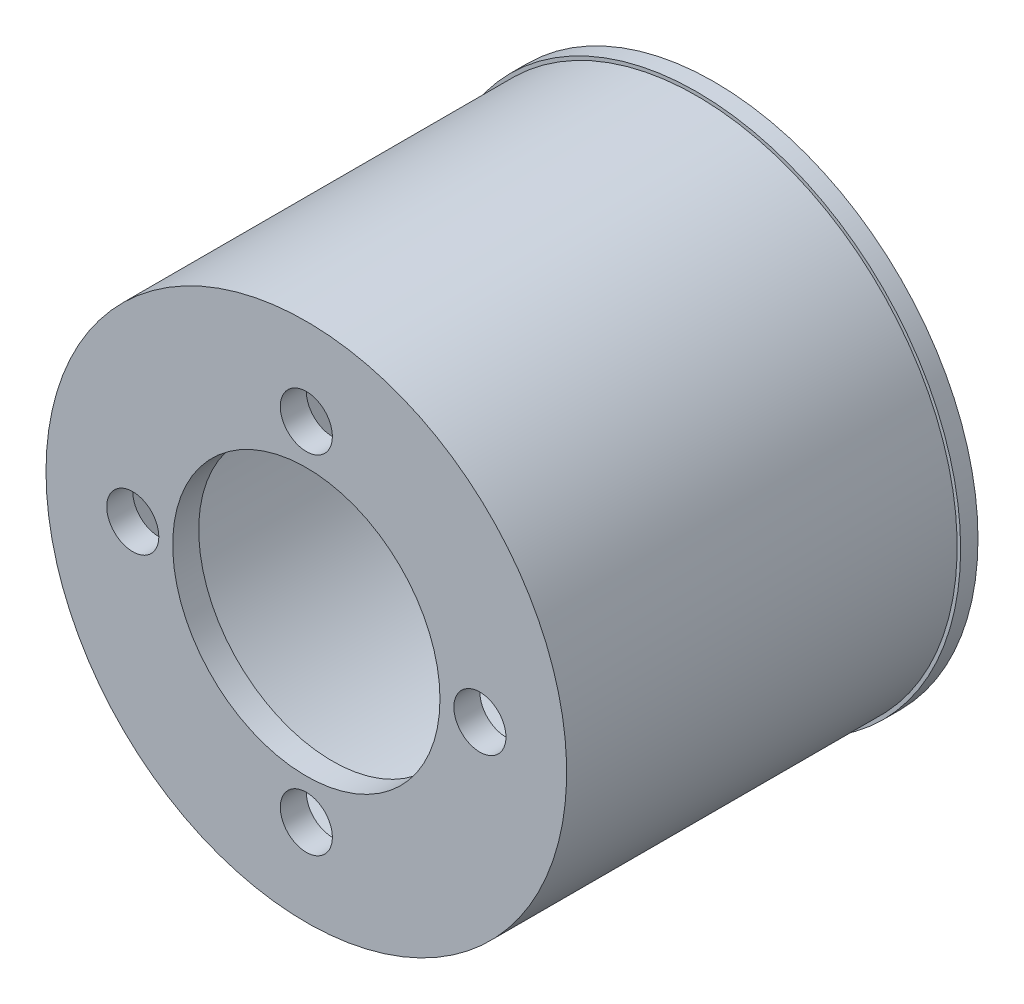
ISO-10303-21;
HEADER;
FILE_DESCRIPTION(('STEP AP214'),'2;1');
FILE_NAME('part.step','',(''),(''),'','','');
FILE_SCHEMA(('AUTOMOTIVE_DESIGN { 1 0 10303 214 1 1 1 1 }'));
ENDSEC;
DATA;
#1=APPLICATION_CONTEXT('core data for automotive mechanical design processes');
#2=APPLICATION_PROTOCOL_DEFINITION('international standard','automotive_design',2000,#1);
#3=PRODUCT_CONTEXT('',#1,'mechanical');
#4=PRODUCT('Part','Part','',(#3));
#5=PRODUCT_RELATED_PRODUCT_CATEGORY('part','',(#4));
#6=PRODUCT_DEFINITION_FORMATION('','',#4);
#7=PRODUCT_DEFINITION_CONTEXT('part definition',#1,'design');
#8=PRODUCT_DEFINITION('design','',#6,#7);
#9=PRODUCT_DEFINITION_SHAPE('','',#8);
#10=(LENGTH_UNIT() NAMED_UNIT(*) SI_UNIT(.MILLI.,.METRE.));
#11=(NAMED_UNIT(*) PLANE_ANGLE_UNIT() SI_UNIT($,.RADIAN.));
#12=(NAMED_UNIT(*) SI_UNIT($,.STERADIAN.) SOLID_ANGLE_UNIT());
#13=UNCERTAINTY_MEASURE_WITH_UNIT(LENGTH_MEASURE(1.E-05),#10,'distance_accuracy_value','');
#14=(GEOMETRIC_REPRESENTATION_CONTEXT(3) GLOBAL_UNCERTAINTY_ASSIGNED_CONTEXT((#13)) GLOBAL_UNIT_ASSIGNED_CONTEXT((#10,
#11,#12)) REPRESENTATION_CONTEXT('',''));
#15=CARTESIAN_POINT('',(0.,0.,0.));
#16=DIRECTION('',(0.,0.,1.));
#17=DIRECTION('',(1.,0.,0.));
#18=AXIS2_PLACEMENT_3D('',#15,#16,#17);
#19=CARTESIAN_POINT('',(0.,0.,21.));
#20=DIRECTION('',(0.,0.,-1.));
#21=DIRECTION('',(-1.,0.,0.));
#22=AXIS2_PLACEMENT_3D('',#19,#20,#21);
#23=CYLINDRICAL_SURFACE('',#22,15.);
#24=CARTESIAN_POINT('',(0.,0.,0.));
#25=DIRECTION('',(0.,0.,-1.));
#26=DIRECTION('',(-1.,0.,0.));
#27=AXIS2_PLACEMENT_3D('',#24,#25,#26);
#28=CIRCLE('',#27,15.);
#29=CARTESIAN_POINT('',(-15.,0.,0.));
#30=VERTEX_POINT('',#29);
#31=EDGE_CURVE('E10',#30,#30,#28,.T.);
#32=CARTESIAN_POINT('',(0.,0.,22.5));
#33=DIRECTION('',(0.,0.,1.));
#34=DIRECTION('',(1.,0.,0.));
#35=AXIS2_PLACEMENT_3D('',#32,#33,#34);
#36=CIRCLE('',#35,15.);
#37=CARTESIAN_POINT('',(-15.,0.,22.5));
#38=VERTEX_POINT('',#37);
#39=EDGE_CURVE('E55',#38,#38,#36,.T.);
#40=CARTESIAN_POINT('',(-15.,0.,0.));
#41=CARTESIAN_POINT('',(-15.,0.,0.234375));
#42=CARTESIAN_POINT('',(-15.,0.,0.468749999999999));
#43=CARTESIAN_POINT('',(-15.,0.,0.9375));
#44=CARTESIAN_POINT('',(-15.,0.,1.171875));
#45=CARTESIAN_POINT('',(-15.,0.,1.640625));
#46=CARTESIAN_POINT('',(-15.,0.,1.875));
#47=CARTESIAN_POINT('',(-15.,0.,2.34375));
#48=CARTESIAN_POINT('',(-15.,0.,2.578125));
#49=CARTESIAN_POINT('',(-15.,0.,3.046875));
#50=CARTESIAN_POINT('',(-15.,0.,3.28125));
#51=CARTESIAN_POINT('',(-15.,0.,3.75));
#52=CARTESIAN_POINT('',(-15.,0.,3.984375));
#53=CARTESIAN_POINT('',(-15.,0.,4.453125));
#54=CARTESIAN_POINT('',(-15.,0.,4.6875));
#55=CARTESIAN_POINT('',(-15.,0.,5.15625));
#56=CARTESIAN_POINT('',(-15.,0.,5.390625));
#57=CARTESIAN_POINT('',(-15.,0.,5.859375));
#58=CARTESIAN_POINT('',(-15.,0.,6.09375));
#59=CARTESIAN_POINT('',(-15.,0.,6.5625));
#60=CARTESIAN_POINT('',(-15.,0.,6.796875));
#61=CARTESIAN_POINT('',(-15.,0.,7.265625));
#62=CARTESIAN_POINT('',(-15.,0.,7.5));
#63=CARTESIAN_POINT('',(-15.,0.,7.96875));
#64=CARTESIAN_POINT('',(-15.,0.,8.203125));
#65=CARTESIAN_POINT('',(-15.,0.,8.671875));
#66=CARTESIAN_POINT('',(-15.,0.,8.90625));
#67=CARTESIAN_POINT('',(-15.,0.,9.375));
#68=CARTESIAN_POINT('',(-15.,0.,9.609375));
#69=CARTESIAN_POINT('',(-15.,0.,10.078125));
#70=CARTESIAN_POINT('',(-15.,0.,10.3125));
#71=CARTESIAN_POINT('',(-15.,0.,10.78125));
#72=CARTESIAN_POINT('',(-15.,0.,11.015625));
#73=CARTESIAN_POINT('',(-15.,0.,11.484375));
#74=CARTESIAN_POINT('',(-15.,0.,11.71875));
#75=CARTESIAN_POINT('',(-15.,0.,12.1875));
#76=CARTESIAN_POINT('',(-15.,0.,12.421875));
#77=CARTESIAN_POINT('',(-15.,0.,12.890625));
#78=CARTESIAN_POINT('',(-15.,0.,13.125));
#79=CARTESIAN_POINT('',(-15.,0.,13.59375));
#80=CARTESIAN_POINT('',(-15.,0.,13.828125));
#81=CARTESIAN_POINT('',(-15.,0.,14.296875));
#82=CARTESIAN_POINT('',(-15.,0.,14.53125));
#83=CARTESIAN_POINT('',(-15.,0.,15.));
#84=CARTESIAN_POINT('',(-15.,0.,15.234375));
#85=CARTESIAN_POINT('',(-15.,0.,15.703125));
#86=CARTESIAN_POINT('',(-15.,0.,15.9375));
#87=CARTESIAN_POINT('',(-15.,0.,16.40625));
#88=CARTESIAN_POINT('',(-15.,0.,16.640625));
#89=CARTESIAN_POINT('',(-15.,0.,17.109375));
#90=CARTESIAN_POINT('',(-15.,0.,17.34375));
#91=CARTESIAN_POINT('',(-15.,0.,17.8125));
#92=CARTESIAN_POINT('',(-15.,0.,18.046875));
#93=CARTESIAN_POINT('',(-15.,0.,18.515625));
#94=CARTESIAN_POINT('',(-15.,0.,18.75));
#95=CARTESIAN_POINT('',(-15.,0.,19.21875));
#96=CARTESIAN_POINT('',(-15.,0.,19.453125));
#97=CARTESIAN_POINT('',(-15.,0.,19.921875));
#98=CARTESIAN_POINT('',(-15.,0.,20.15625));
#99=CARTESIAN_POINT('',(-15.,0.,20.625));
#100=CARTESIAN_POINT('',(-15.,0.,20.859375));
#101=CARTESIAN_POINT('',(-15.,0.,21.328125));
#102=CARTESIAN_POINT('',(-15.,0.,21.5625));
#103=CARTESIAN_POINT('',(-15.,0.,22.03125));
#104=CARTESIAN_POINT('',(-15.,0.,22.265625));
#105=CARTESIAN_POINT('',(-15.,0.,22.5));
#106=B_SPLINE_CURVE_WITH_KNOTS('',3,(#40,#41,#42,#43,#44,#45,#46,#47,#48,#49,#50,#51,#52,#53,
#54,#55,#56,#57,#58,#59,#60,#61,#62,#63,#64,#65,#66,#67,#68,#69,#70,#71,#72,#73,#74,#75,#76,#77,
#78,#79,#80,#81,#82,#83,#84,#85,#86,#87,#88,#89,#90,#91,#92,#93,#94,#95,#96,#97,#98,#99,#100,
#101,#102,#103,#104,#105),.UNSPECIFIED.,.F.,.F.,(4,2,2,2,2,2,2,2,2,2,2,2,2,2,2,2,2,2,2,2,2,2,2,
2,2,2,2,2,2,2,2,2,4),(0.,0.703124999999999,1.40625,2.109375,2.8125,3.515625,4.21875,4.921875,
5.625,6.328125,7.03125,7.734375,8.4375,9.140625,9.84375,10.546875,11.25,11.953125,12.65625,
13.359375,14.0625,14.765625,15.46875,16.171875,16.875,17.578125,18.28125,18.984375,19.6875,
20.390625,21.09375,21.796875,22.5),.UNSPECIFIED.);
#107=EDGE_CURVE('BSEAM33',#30,#38,#106,.T.);
#108=ORIENTED_EDGE('',*,*,#31,.F.);
#109=ORIENTED_EDGE('',*,*,#39,.F.);
#110=ORIENTED_EDGE('',*,*,#107,.T.);
#111=ORIENTED_EDGE('',*,*,#107,.F.);
#112=EDGE_LOOP('',(#108,#110,#109,#111));
#113=FACE_BOUND('',#112,.T.);
#114=ADVANCED_FACE('F33',(#113),#23,.T.);
#115=CARTESIAN_POINT('',(0.,0.,21.));
#116=DIRECTION('',(0.,0.,-1.));
#117=DIRECTION('',(-1.,0.,0.));
#118=AXIS2_PLACEMENT_3D('',#115,#116,#117);
#119=CYLINDRICAL_SURFACE('',#118,13.35);
#120=CARTESIAN_POINT('',(0.,0.,21.));
#121=DIRECTION('',(0.,0.,1.));
#122=DIRECTION('',(1.,0.,0.));
#123=AXIS2_PLACEMENT_3D('',#120,#121,#122);
#124=CIRCLE('',#123,13.35);
#125=CARTESIAN_POINT('',(-13.35,0.,21.));
#126=VERTEX_POINT('',#125);
#127=EDGE_CURVE('E52',#126,#126,#124,.T.);
#128=CARTESIAN_POINT('',(0.,0.,-1.));
#129=DIRECTION('',(0.,0.,-1.));
#130=DIRECTION('',(-1.,0.,0.));
#131=AXIS2_PLACEMENT_3D('',#128,#129,#130);
#132=CIRCLE('',#131,13.35);
#133=CARTESIAN_POINT('',(-13.35,0.,-1.));
#134=VERTEX_POINT('',#133);
#135=EDGE_CURVE('E48',#134,#134,#132,.T.);
#136=CARTESIAN_POINT('',(-13.35,0.,21.));
#137=CARTESIAN_POINT('',(-13.35,0.,20.7708333333333));
#138=CARTESIAN_POINT('',(-13.35,0.,20.5416666666667));
#139=CARTESIAN_POINT('',(-13.35,0.,20.0833333333333));
#140=CARTESIAN_POINT('',(-13.35,0.,19.8541666666667));
#141=CARTESIAN_POINT('',(-13.35,0.,19.3958333333333));
#142=CARTESIAN_POINT('',(-13.35,0.,19.1666666666667));
#143=CARTESIAN_POINT('',(-13.35,0.,18.7083333333333));
#144=CARTESIAN_POINT('',(-13.35,0.,18.4791666666667));
#145=CARTESIAN_POINT('',(-13.35,0.,18.0208333333333));
#146=CARTESIAN_POINT('',(-13.35,0.,17.7916666666667));
#147=CARTESIAN_POINT('',(-13.35,0.,17.3333333333333));
#148=CARTESIAN_POINT('',(-13.35,0.,17.1041666666667));
#149=CARTESIAN_POINT('',(-13.35,0.,16.6458333333333));
#150=CARTESIAN_POINT('',(-13.35,0.,16.4166666666667));
#151=CARTESIAN_POINT('',(-13.35,0.,15.9583333333333));
#152=CARTESIAN_POINT('',(-13.35,0.,15.7291666666667));
#153=CARTESIAN_POINT('',(-13.35,0.,15.2708333333333));
#154=CARTESIAN_POINT('',(-13.35,0.,15.0416666666667));
#155=CARTESIAN_POINT('',(-13.35,0.,14.5833333333333));
#156=CARTESIAN_POINT('',(-13.35,0.,14.3541666666667));
#157=CARTESIAN_POINT('',(-13.35,0.,13.8958333333333));
#158=CARTESIAN_POINT('',(-13.35,0.,13.6666666666667));
#159=CARTESIAN_POINT('',(-13.35,0.,13.2083333333333));
#160=CARTESIAN_POINT('',(-13.35,0.,12.9791666666667));
#161=CARTESIAN_POINT('',(-13.35,0.,12.5208333333333));
#162=CARTESIAN_POINT('',(-13.35,0.,12.2916666666667));
#163=CARTESIAN_POINT('',(-13.35,0.,11.8333333333333));
#164=CARTESIAN_POINT('',(-13.35,0.,11.6041666666667));
#165=CARTESIAN_POINT('',(-13.35,0.,11.1458333333333));
#166=CARTESIAN_POINT('',(-13.35,0.,10.9166666666667));
#167=CARTESIAN_POINT('',(-13.35,0.,10.4583333333333));
#168=CARTESIAN_POINT('',(-13.35,0.,10.2291666666667));
#169=CARTESIAN_POINT('',(-13.35,0.,9.77083333333333));
#170=CARTESIAN_POINT('',(-13.35,0.,9.54166666666667));
#171=CARTESIAN_POINT('',(-13.35,0.,9.08333333333333));
#172=CARTESIAN_POINT('',(-13.35,0.,8.85416666666667));
#173=CARTESIAN_POINT('',(-13.35,0.,8.39583333333333));
#174=CARTESIAN_POINT('',(-13.35,0.,8.16666666666667));
#175=CARTESIAN_POINT('',(-13.35,0.,7.70833333333333));
#176=CARTESIAN_POINT('',(-13.35,0.,7.47916666666667));
#177=CARTESIAN_POINT('',(-13.35,0.,7.02083333333333));
#178=CARTESIAN_POINT('',(-13.35,0.,6.79166666666667));
#179=CARTESIAN_POINT('',(-13.35,0.,6.33333333333333));
#180=CARTESIAN_POINT('',(-13.35,0.,6.10416666666667));
#181=CARTESIAN_POINT('',(-13.35,0.,5.64583333333333));
#182=CARTESIAN_POINT('',(-13.35,0.,5.41666666666667));
#183=CARTESIAN_POINT('',(-13.35,0.,4.95833333333333));
#184=CARTESIAN_POINT('',(-13.35,0.,4.72916666666667));
#185=CARTESIAN_POINT('',(-13.35,0.,4.27083333333333));
#186=CARTESIAN_POINT('',(-13.35,0.,4.04166666666667));
#187=CARTESIAN_POINT('',(-13.35,0.,3.58333333333333));
#188=CARTESIAN_POINT('',(-13.35,0.,3.35416666666667));
#189=CARTESIAN_POINT('',(-13.35,0.,2.89583333333333));
#190=CARTESIAN_POINT('',(-13.35,0.,2.66666666666667));
#191=CARTESIAN_POINT('',(-13.35,0.,2.20833333333333));
#192=CARTESIAN_POINT('',(-13.35,0.,1.97916666666667));
#193=CARTESIAN_POINT('',(-13.35,0.,1.52083333333333));
#194=CARTESIAN_POINT('',(-13.35,0.,1.29166666666667));
#195=CARTESIAN_POINT('',(-13.35,0.,0.833333333333334));
#196=CARTESIAN_POINT('',(-13.35,0.,0.604166666666667));
#197=CARTESIAN_POINT('',(-13.35,0.,0.145833333333334));
#198=CARTESIAN_POINT('',(-13.35,0.,-0.0833333333333333));
#199=CARTESIAN_POINT('',(-13.35,0.,-0.541666666666667));
#200=CARTESIAN_POINT('',(-13.35,0.,-0.770833333333334));
#201=CARTESIAN_POINT('',(-13.35,0.,-1.));
#202=B_SPLINE_CURVE_WITH_KNOTS('',3,(#136,#137,#138,#139,#140,#141,#142,#143,#144,#145,#146,
#147,#148,#149,#150,#151,#152,#153,#154,#155,#156,#157,#158,#159,#160,#161,#162,#163,#164,#165,
#166,#167,#168,#169,#170,#171,#172,#173,#174,#175,#176,#177,#178,#179,#180,#181,#182,#183,#184,
#185,#186,#187,#188,#189,#190,#191,#192,#193,#194,#195,#196,#197,#198,#199,#200,#201),
.UNSPECIFIED.,.F.,.F.,(4,2,2,2,2,2,2,2,2,2,2,2,2,2,2,2,2,2,2,2,2,2,2,2,2,2,2,2,2,2,2,2,4),(0.,
0.687499999999997,1.375,2.0625,2.75,3.4375,4.125,4.8125,5.5,6.1875,6.875,7.5625,8.25,8.9375,
9.625,10.3125,11.,11.6875,12.375,13.0625,13.75,14.4375,15.125,15.8125,16.5,17.1875,17.875,
18.5625,19.25,19.9375,20.625,21.3125,22.),.UNSPECIFIED.);
#203=EDGE_CURVE('BSEAM111',#126,#134,#202,.T.);
#204=ORIENTED_EDGE('',*,*,#127,.T.);
#205=ORIENTED_EDGE('',*,*,#135,.T.);
#206=ORIENTED_EDGE('',*,*,#203,.T.);
#207=ORIENTED_EDGE('',*,*,#203,.F.);
#208=EDGE_LOOP('',(#204,#206,#205,#207));
#209=FACE_BOUND('',#208,.T.);
#210=ADVANCED_FACE('F111',(#209),#119,.F.);
#211=CARTESIAN_POINT('',(0.,0.,0.));
#212=DIRECTION('',(0.,0.,-1.));
#213=DIRECTION('',(-1.,0.,0.));
#214=AXIS2_PLACEMENT_3D('',#211,#212,#213);
#215=PLANE('',#214);
#216=CARTESIAN_POINT('',(0.,0.,0.));
#217=DIRECTION('',(0.,0.,-1.));
#218=DIRECTION('',(-1.,0.,0.));
#219=AXIS2_PLACEMENT_3D('',#216,#217,#218);
#220=CIRCLE('',#219,15.2);
#221=CARTESIAN_POINT('',(-15.2,0.,0.));
#222=VERTEX_POINT('',#221);
#223=EDGE_CURVE('E43',#222,#222,#220,.T.);
#224=ORIENTED_EDGE('',*,*,#223,.F.);
#225=EDGE_LOOP('',(#224));
#226=FACE_BOUND('',#225,.T.);
#227=ORIENTED_EDGE('',*,*,#31,.T.);
#228=EDGE_LOOP('',(#227));
#229=FACE_BOUND('',#228,.T.);
#230=ADVANCED_FACE('F116',(#226,#229),#215,.F.);
#231=CARTESIAN_POINT('',(0.,0.,-1.));
#232=DIRECTION('',(0.,0.,-1.));
#233=DIRECTION('',(-1.,0.,0.));
#234=AXIS2_PLACEMENT_3D('',#231,#232,#233);
#235=PLANE('',#234);
#236=CARTESIAN_POINT('',(0.,0.,-1.));
#237=DIRECTION('',(0.,0.,-1.));
#238=DIRECTION('',(-1.,0.,0.));
#239=AXIS2_PLACEMENT_3D('',#236,#237,#238);
#240=CIRCLE('',#239,15.2);
#241=CARTESIAN_POINT('',(-15.2,0.,-1.));
#242=VERTEX_POINT('',#241);
#243=EDGE_CURVE('E39',#242,#242,#240,.T.);
#244=ORIENTED_EDGE('',*,*,#243,.T.);
#245=EDGE_LOOP('',(#244));
#246=FACE_BOUND('',#245,.T.);
#247=ORIENTED_EDGE('',*,*,#135,.F.);
#248=EDGE_LOOP('',(#247));
#249=FACE_BOUND('',#248,.T.);
#250=ADVANCED_FACE('F142',(#246,#249),#235,.T.);
#251=CARTESIAN_POINT('',(0.,0.,-1.));
#252=DIRECTION('',(0.,0.,1.));
#253=DIRECTION('',(1.,0.,0.));
#254=AXIS2_PLACEMENT_3D('',#251,#252,#253);
#255=CYLINDRICAL_SURFACE('',#254,15.2);
#256=ORIENTED_EDGE('',*,*,#243,.F.);
#257=EDGE_LOOP('',(#256));
#258=FACE_BOUND('',#257,.T.);
#259=ORIENTED_EDGE('',*,*,#223,.T.);
#260=EDGE_LOOP('',(#259));
#261=FACE_BOUND('',#260,.T.);
#262=ADVANCED_FACE('F105',(#258,#261),#255,.T.);
#263=CARTESIAN_POINT('',(0.,0.,21.));
#264=DIRECTION('',(0.,0.,1.));
#265=DIRECTION('',(1.,0.,0.));
#266=AXIS2_PLACEMENT_3D('',#263,#264,#265);
#267=PLANE('',#266);
#268=CARTESIAN_POINT('',(10.,0.,21.));
#269=DIRECTION('',(0.,0.,1.));
#270=DIRECTION('',(1.,0.,0.));
#271=AXIS2_PLACEMENT_3D('',#268,#269,#270);
#272=CIRCLE('',#271,1.5);
#273=CARTESIAN_POINT('',(11.5,0.,21.));
#274=VERTEX_POINT('',#273);
#275=EDGE_CURVE('E83',#274,#274,#272,.T.);
#276=ORIENTED_EDGE('',*,*,#275,.T.);
#277=EDGE_LOOP('',(#276));
#278=FACE_BOUND('',#277,.T.);
#279=CARTESIAN_POINT('',(-10.,0.,21.));
#280=DIRECTION('',(0.,0.,1.));
#281=DIRECTION('',(1.,0.,0.));
#282=AXIS2_PLACEMENT_3D('',#279,#280,#281);
#283=CIRCLE('',#282,1.5);
#284=CARTESIAN_POINT('',(-8.5,0.,21.));
#285=VERTEX_POINT('',#284);
#286=EDGE_CURVE('E77',#285,#285,#283,.T.);
#287=ORIENTED_EDGE('',*,*,#286,.T.);
#288=EDGE_LOOP('',(#287));
#289=FACE_BOUND('',#288,.T.);
#290=CARTESIAN_POINT('',(0.,10.,21.));
#291=DIRECTION('',(0.,0.,1.));
#292=DIRECTION('',(1.,0.,0.));
#293=AXIS2_PLACEMENT_3D('',#290,#291,#292);
#294=CIRCLE('',#293,1.5);
#295=CARTESIAN_POINT('',(1.49999999999999,10.,21.));
#296=VERTEX_POINT('',#295);
#297=EDGE_CURVE('E71',#296,#296,#294,.T.);
#298=ORIENTED_EDGE('',*,*,#297,.T.);
#299=EDGE_LOOP('',(#298));
#300=FACE_BOUND('',#299,.T.);
#301=CARTESIAN_POINT('',(0.,-10.,21.));
#302=DIRECTION('',(0.,0.,1.));
#303=DIRECTION('',(1.,0.,0.));
#304=AXIS2_PLACEMENT_3D('',#301,#302,#303);
#305=CIRCLE('',#304,1.5);
#306=CARTESIAN_POINT('',(1.5,-10.,21.));
#307=VERTEX_POINT('',#306);
#308=EDGE_CURVE('E65',#307,#307,#305,.T.);
#309=ORIENTED_EDGE('',*,*,#308,.T.);
#310=EDGE_LOOP('',(#309));
#311=FACE_BOUND('',#310,.T.);
#312=CARTESIAN_POINT('',(0.,0.,21.));
#313=DIRECTION('',(0.,0.,1.));
#314=DIRECTION('',(1.,0.,0.));
#315=AXIS2_PLACEMENT_3D('',#312,#313,#314);
#316=CIRCLE('',#315,7.7);
#317=CARTESIAN_POINT('',(7.7,0.,21.));
#318=VERTEX_POINT('',#317);
#319=EDGE_CURVE('E59',#318,#318,#316,.T.);
#320=ORIENTED_EDGE('',*,*,#319,.T.);
#321=EDGE_LOOP('',(#320));
#322=FACE_BOUND('',#321,.T.);
#323=ORIENTED_EDGE('',*,*,#127,.F.);
#324=EDGE_LOOP('',(#323));
#325=FACE_BOUND('',#324,.T.);
#326=ADVANCED_FACE('F95',(#278,#289,#300,#311,#322,#325),#267,.F.);
#327=CARTESIAN_POINT('',(0.,0.,22.5));
#328=DIRECTION('',(0.,0.,1.));
#329=DIRECTION('',(1.,0.,0.));
#330=AXIS2_PLACEMENT_3D('',#327,#328,#329);
#331=PLANE('',#330);
#332=CARTESIAN_POINT('',(-10.,0.,22.5));
#333=DIRECTION('',(0.,0.,1.));
#334=DIRECTION('',(1.,0.,0.));
#335=AXIS2_PLACEMENT_3D('',#332,#333,#334);
#336=CIRCLE('',#335,1.5);
#337=CARTESIAN_POINT('',(-8.5,0.,22.5));
#338=VERTEX_POINT('',#337);
#339=EDGE_CURVE('E74',#338,#338,#336,.T.);
#340=ORIENTED_EDGE('',*,*,#339,.F.);
#341=EDGE_LOOP('',(#340));
#342=FACE_BOUND('',#341,.T.);
#343=CARTESIAN_POINT('',(0.,-10.,22.5));
#344=DIRECTION('',(0.,0.,1.));
#345=DIRECTION('',(1.,0.,0.));
#346=AXIS2_PLACEMENT_3D('',#343,#344,#345);
#347=CIRCLE('',#346,1.5);
#348=CARTESIAN_POINT('',(1.5,-10.,22.5));
#349=VERTEX_POINT('',#348);
#350=EDGE_CURVE('E62',#349,#349,#347,.T.);
#351=ORIENTED_EDGE('',*,*,#350,.F.);
#352=EDGE_LOOP('',(#351));
#353=FACE_BOUND('',#352,.T.);
#354=ORIENTED_EDGE('',*,*,#39,.T.);
#355=EDGE_LOOP('',(#354));
#356=FACE_BOUND('',#355,.T.);
#357=CARTESIAN_POINT('',(0.,0.,22.5));
#358=DIRECTION('',(0.,0.,1.));
#359=DIRECTION('',(1.,0.,0.));
#360=AXIS2_PLACEMENT_3D('',#357,#358,#359);
#361=CIRCLE('',#360,7.7);
#362=CARTESIAN_POINT('',(7.7,0.,22.5));
#363=VERTEX_POINT('',#362);
#364=EDGE_CURVE('E58',#363,#363,#361,.T.);
#365=ORIENTED_EDGE('',*,*,#364,.F.);
#366=EDGE_LOOP('',(#365));
#367=FACE_BOUND('',#366,.T.);
#368=CARTESIAN_POINT('',(0.,10.,22.5));
#369=DIRECTION('',(0.,0.,1.));
#370=DIRECTION('',(1.,0.,0.));
#371=AXIS2_PLACEMENT_3D('',#368,#369,#370);
#372=CIRCLE('',#371,1.5);
#373=CARTESIAN_POINT('',(1.49999999999999,10.,22.5));
#374=VERTEX_POINT('',#373);
#375=EDGE_CURVE('E68',#374,#374,#372,.T.);
#376=ORIENTED_EDGE('',*,*,#375,.F.);
#377=EDGE_LOOP('',(#376));
#378=FACE_BOUND('',#377,.T.);
#379=CARTESIAN_POINT('',(10.,0.,22.5));
#380=DIRECTION('',(0.,0.,1.));
#381=DIRECTION('',(1.,0.,0.));
#382=AXIS2_PLACEMENT_3D('',#379,#380,#381);
#383=CIRCLE('',#382,1.5);
#384=CARTESIAN_POINT('',(11.5,0.,22.5));
#385=VERTEX_POINT('',#384);
#386=EDGE_CURVE('E80',#385,#385,#383,.T.);
#387=ORIENTED_EDGE('',*,*,#386,.F.);
#388=EDGE_LOOP('',(#387));
#389=FACE_BOUND('',#388,.T.);
#390=ADVANCED_FACE('F92',(#342,#353,#356,#367,#378,#389),#331,.T.);
#391=CARTESIAN_POINT('',(0.,0.,22.5));
#392=DIRECTION('',(0.,0.,-1.));
#393=DIRECTION('',(-1.,0.,0.));
#394=AXIS2_PLACEMENT_3D('',#391,#392,#393);
#395=CYLINDRICAL_SURFACE('',#394,7.7);
#396=ORIENTED_EDGE('',*,*,#364,.T.);
#397=EDGE_LOOP('',(#396));
#398=FACE_BOUND('',#397,.T.);
#399=ORIENTED_EDGE('',*,*,#319,.F.);
#400=EDGE_LOOP('',(#399));
#401=FACE_BOUND('',#400,.T.);
#402=ADVANCED_FACE('F94',(#398,#401),#395,.F.);
#403=CARTESIAN_POINT('',(0.,-10.,22.5));
#404=DIRECTION('',(0.,0.,-1.));
#405=DIRECTION('',(-1.,0.,0.));
#406=AXIS2_PLACEMENT_3D('',#403,#404,#405);
#407=CYLINDRICAL_SURFACE('',#406,1.5);
#408=ORIENTED_EDGE('',*,*,#350,.T.);
#409=EDGE_LOOP('',(#408));
#410=FACE_BOUND('',#409,.T.);
#411=ORIENTED_EDGE('',*,*,#308,.F.);
#412=EDGE_LOOP('',(#411));
#413=FACE_BOUND('',#412,.T.);
#414=ADVANCED_FACE('F102',(#410,#413),#407,.F.);
#415=CARTESIAN_POINT('',(0.,10.,22.5));
#416=DIRECTION('',(0.,0.,-1.));
#417=DIRECTION('',(-1.,0.,0.));
#418=AXIS2_PLACEMENT_3D('',#415,#416,#417);
#419=CYLINDRICAL_SURFACE('',#418,1.5);
#420=ORIENTED_EDGE('',*,*,#375,.T.);
#421=EDGE_LOOP('',(#420));
#422=FACE_BOUND('',#421,.T.);
#423=ORIENTED_EDGE('',*,*,#297,.F.);
#424=EDGE_LOOP('',(#423));
#425=FACE_BOUND('',#424,.T.);
#426=ADVANCED_FACE('F126',(#422,#425),#419,.F.);
#427=CARTESIAN_POINT('',(-10.,0.,22.5));
#428=DIRECTION('',(0.,0.,-1.));
#429=DIRECTION('',(-1.,0.,0.));
#430=AXIS2_PLACEMENT_3D('',#427,#428,#429);
#431=CYLINDRICAL_SURFACE('',#430,1.5);
#432=ORIENTED_EDGE('',*,*,#339,.T.);
#433=EDGE_LOOP('',(#432));
#434=FACE_BOUND('',#433,.T.);
#435=ORIENTED_EDGE('',*,*,#286,.F.);
#436=EDGE_LOOP('',(#435));
#437=FACE_BOUND('',#436,.T.);
#438=ADVANCED_FACE('F129',(#434,#437),#431,.F.);
#439=CARTESIAN_POINT('',(10.,0.,22.5));
#440=DIRECTION('',(0.,0.,-1.));
#441=DIRECTION('',(-1.,0.,0.));
#442=AXIS2_PLACEMENT_3D('',#439,#440,#441);
#443=CYLINDRICAL_SURFACE('',#442,1.5);
#444=ORIENTED_EDGE('',*,*,#386,.T.);
#445=EDGE_LOOP('',(#444));
#446=FACE_BOUND('',#445,.T.);
#447=ORIENTED_EDGE('',*,*,#275,.F.);
#448=EDGE_LOOP('',(#447));
#449=FACE_BOUND('',#448,.T.);
#450=ADVANCED_FACE('F89',(#446,#449),#443,.F.);
#451=CLOSED_SHELL('',(#114,#210,#230,#250,#262,#326,#390,#402,#414,#426,#438,#450));
#452=MANIFOLD_SOLID_BREP('B2',#451);
#453=ADVANCED_BREP_SHAPE_REPRESENTATION('',(#18,#452),#14);
#454=SHAPE_DEFINITION_REPRESENTATION(#9,#453);
ENDSEC;
END-ISO-10303-21;
